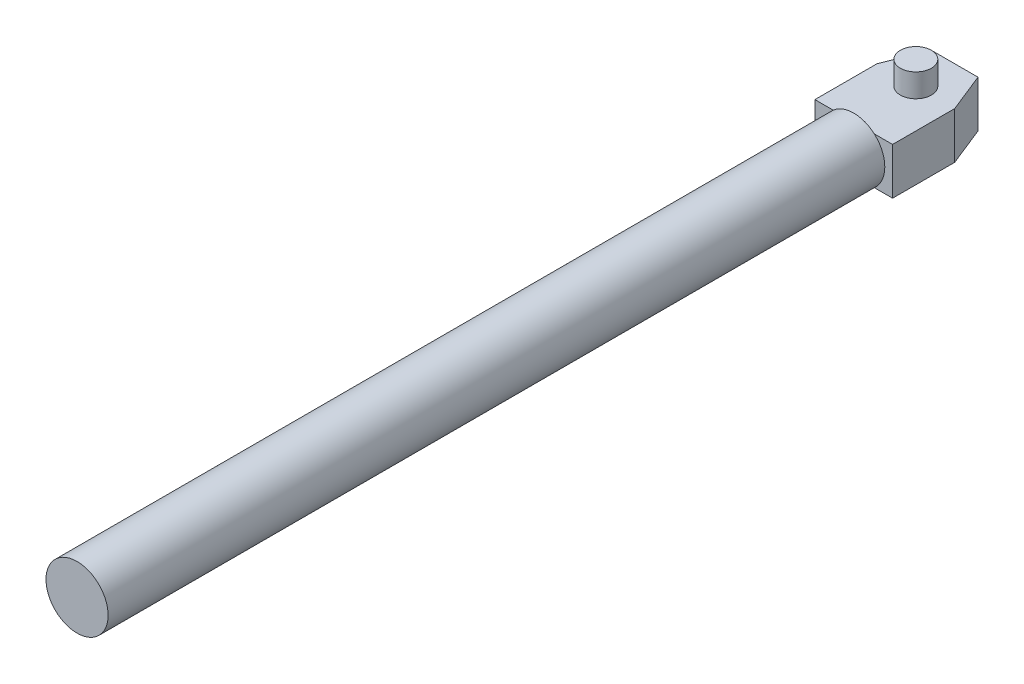
ISO-10303-21;
HEADER;
FILE_DESCRIPTION(('STEP AP214'),'2;1');
FILE_NAME('part.step','',(''),(''),'','','');
FILE_SCHEMA(('AUTOMOTIVE_DESIGN { 1 0 10303 214 1 1 1 1 }'));
ENDSEC;
DATA;
#1=APPLICATION_CONTEXT('core data for automotive mechanical design processes');
#2=APPLICATION_PROTOCOL_DEFINITION('international standard','automotive_design',2000,#1);
#3=PRODUCT_CONTEXT('',#1,'mechanical');
#4=PRODUCT('Part','Part','',(#3));
#5=PRODUCT_RELATED_PRODUCT_CATEGORY('part','',(#4));
#6=PRODUCT_DEFINITION_FORMATION('','',#4);
#7=PRODUCT_DEFINITION_CONTEXT('part definition',#1,'design');
#8=PRODUCT_DEFINITION('design','',#6,#7);
#9=PRODUCT_DEFINITION_SHAPE('','',#8);
#10=(LENGTH_UNIT() NAMED_UNIT(*) SI_UNIT(.MILLI.,.METRE.));
#11=(NAMED_UNIT(*) PLANE_ANGLE_UNIT() SI_UNIT($,.RADIAN.));
#12=(NAMED_UNIT(*) SI_UNIT($,.STERADIAN.) SOLID_ANGLE_UNIT());
#13=UNCERTAINTY_MEASURE_WITH_UNIT(LENGTH_MEASURE(1.E-05),#10,'distance_accuracy_value','');
#14=(GEOMETRIC_REPRESENTATION_CONTEXT(3) GLOBAL_UNCERTAINTY_ASSIGNED_CONTEXT((#13)) GLOBAL_UNIT_ASSIGNED_CONTEXT((#10,
#11,#12)) REPRESENTATION_CONTEXT('',''));
#15=CARTESIAN_POINT('',(0.,0.,0.));
#16=DIRECTION('',(0.,0.,1.));
#17=DIRECTION('',(1.,0.,0.));
#18=AXIS2_PLACEMENT_3D('',#15,#16,#17);
#19=CARTESIAN_POINT('',(0.,0.,0.));
#20=DIRECTION('',(0.,0.,1.));
#21=DIRECTION('',(1.,0.,0.));
#22=AXIS2_PLACEMENT_3D('',#19,#20,#21);
#23=PLANE('',#22);
#24=DIRECTION('',(1.,0.,0.));
#25=VECTOR('',#24,1.);
#26=CARTESIAN_POINT('',(-25.,15.,0.));
#27=LINE('',#26,#25);
#28=CARTESIAN_POINT('',(-13.2287565553229,15.,0.));
#29=VERTEX_POINT('',#28);
#30=CARTESIAN_POINT('',(13.2287565553229,15.,0.));
#31=VERTEX_POINT('',#30);
#32=EDGE_CURVE('E114',#29,#31,#27,.T.);
#33=ORIENTED_EDGE('',*,*,#32,.F.);
#34=CARTESIAN_POINT('',(0.,0.,0.));
#35=DIRECTION('',(0.,0.,1.));
#36=DIRECTION('',(1.,0.,0.));
#37=AXIS2_PLACEMENT_3D('',#34,#35,#36);
#38=CIRCLE('',#37,20.);
#39=EDGE_CURVE('E132',#31,#29,#38,.T.);
#40=ORIENTED_EDGE('',*,*,#39,.F.);
#41=EDGE_LOOP('',(#33,#40));
#42=FACE_BOUND('',#41,.T.);
#43=ADVANCED_FACE('F36',(#42),#23,.F.);
#44=CARTESIAN_POINT('',(0.,0.,500.));
#45=DIRECTION('',(0.,0.,-1.));
#46=DIRECTION('',(-1.,0.,0.));
#47=AXIS2_PLACEMENT_3D('',#44,#45,#46);
#48=CYLINDRICAL_SURFACE('',#47,20.);
#49=CARTESIAN_POINT('',(0.,0.,500.));
#50=DIRECTION('',(0.,0.,1.));
#51=DIRECTION('',(1.,0.,0.));
#52=AXIS2_PLACEMENT_3D('',#49,#50,#51);
#53=CIRCLE('',#52,20.);
#54=CARTESIAN_POINT('',(20.,0.,500.));
#55=VERTEX_POINT('',#54);
#56=EDGE_CURVE('E138',#55,#55,#53,.T.);
#57=ORIENTED_EDGE('',*,*,#56,.F.);
#58=EDGE_LOOP('',(#57));
#59=FACE_BOUND('',#58,.T.);
#60=ORIENTED_EDGE('',*,*,#39,.T.);
#61=CARTESIAN_POINT('',(-13.2287565553229,-15.,0.));
#62=VERTEX_POINT('',#61);
#63=EDGE_CURVE('E108',#29,#62,#38,.T.);
#64=ORIENTED_EDGE('',*,*,#63,.T.);
#65=CARTESIAN_POINT('',(13.2287565553229,-15.,0.));
#66=VERTEX_POINT('',#65);
#67=EDGE_CURVE('E54',#62,#66,#38,.T.);
#68=ORIENTED_EDGE('',*,*,#67,.T.);
#69=EDGE_CURVE('E128',#66,#31,#38,.T.);
#70=ORIENTED_EDGE('',*,*,#69,.T.);
#71=EDGE_LOOP('',(#60,#64,#68,#70));
#72=FACE_BOUND('',#71,.T.);
#73=ADVANCED_FACE('F38',(#59,#72),#48,.T.);
#74=CARTESIAN_POINT('',(0.,0.,500.));
#75=DIRECTION('',(0.,0.,1.));
#76=DIRECTION('',(1.,0.,0.));
#77=AXIS2_PLACEMENT_3D('',#74,#75,#76);
#78=PLANE('',#77);
#79=ORIENTED_EDGE('',*,*,#56,.T.);
#80=EDGE_LOOP('',(#79));
#81=FACE_BOUND('',#80,.T.);
#82=ADVANCED_FACE('F208',(#81),#78,.T.);
#83=ORIENTED_EDGE('',*,*,#67,.F.);
#84=DIRECTION('',(1.,0.,0.));
#85=VECTOR('',#84,1.);
#86=CARTESIAN_POINT('',(-25.,-15.,0.));
#87=LINE('',#86,#85);
#88=EDGE_CURVE('E45',#62,#66,#87,.T.);
#89=ORIENTED_EDGE('',*,*,#88,.T.);
#90=EDGE_LOOP('',(#83,#89));
#91=FACE_BOUND('',#90,.T.);
#92=ADVANCED_FACE('F204',(#91),#23,.F.);
#93=CARTESIAN_POINT('',(-25.,15.,0.));
#94=DIRECTION('',(0.,0.,-1.));
#95=DIRECTION('',(-1.,0.,0.));
#96=AXIS2_PLACEMENT_3D('',#93,#94,#95);
#97=PLANE('',#96);
#98=ORIENTED_EDGE('',*,*,#63,.F.);
#99=CARTESIAN_POINT('',(-25.,15.,0.));
#100=VERTEX_POINT('',#99);
#101=EDGE_CURVE('E101',#100,#29,#27,.T.);
#102=ORIENTED_EDGE('',*,*,#101,.F.);
#103=DIRECTION('',(0.,-1.,0.));
#104=VECTOR('',#103,1.);
#105=CARTESIAN_POINT('',(-25.,15.,0.));
#106=LINE('',#105,#104);
#107=CARTESIAN_POINT('',(-25.,-15.,0.));
#108=VERTEX_POINT('',#107);
#109=EDGE_CURVE('E106',#100,#108,#106,.T.);
#110=ORIENTED_EDGE('',*,*,#109,.T.);
#111=EDGE_CURVE('E154',#108,#62,#87,.T.);
#112=ORIENTED_EDGE('',*,*,#111,.T.);
#113=EDGE_LOOP('',(#98,#102,#110,#112));
#114=FACE_BOUND('',#113,.T.);
#115=ADVANCED_FACE('F103',(#114),#97,.F.);
#116=CARTESIAN_POINT('',(-25.,15.,0.));
#117=DIRECTION('',(1.,0.,0.));
#118=DIRECTION('',(0.,0.,-1.));
#119=AXIS2_PLACEMENT_3D('',#116,#117,#118);
#120=PLANE('',#119);
#121=DIRECTION('',(0.,0.,1.));
#122=VECTOR('',#121,1.);
#123=CARTESIAN_POINT('',(-25.,-15.,0.));
#124=LINE('',#123,#122);
#125=CARTESIAN_POINT('',(-25.,-15.,-40.));
#126=VERTEX_POINT('',#125);
#127=EDGE_CURVE('E127',#126,#108,#124,.T.);
#128=ORIENTED_EDGE('',*,*,#127,.T.);
#129=ORIENTED_EDGE('',*,*,#109,.F.);
#130=DIRECTION('',(0.,0.,1.));
#131=VECTOR('',#130,1.);
#132=CARTESIAN_POINT('',(-25.,15.,0.));
#133=LINE('',#132,#131);
#134=CARTESIAN_POINT('',(-25.,15.,-40.));
#135=VERTEX_POINT('',#134);
#136=EDGE_CURVE('E116',#135,#100,#133,.T.);
#137=ORIENTED_EDGE('',*,*,#136,.F.);
#138=DIRECTION('',(0.,-1.,0.));
#139=VECTOR('',#138,1.);
#140=CARTESIAN_POINT('',(-25.,15.,-40.));
#141=LINE('',#140,#139);
#142=EDGE_CURVE('E170',#135,#126,#141,.T.);
#143=ORIENTED_EDGE('',*,*,#142,.T.);
#144=EDGE_LOOP('',(#128,#129,#137,#143));
#145=FACE_BOUND('',#144,.T.);
#146=ADVANCED_FACE('F125',(#145),#120,.F.);
#147=ORIENTED_EDGE('',*,*,#69,.F.);
#148=CARTESIAN_POINT('',(25.,-15.,0.));
#149=VERTEX_POINT('',#148);
#150=EDGE_CURVE('E148',#66,#149,#87,.T.);
#151=ORIENTED_EDGE('',*,*,#150,.T.);
#152=DIRECTION('',(0.,-1.,0.));
#153=VECTOR('',#152,1.);
#154=CARTESIAN_POINT('',(25.,15.,0.));
#155=LINE('',#154,#153);
#156=CARTESIAN_POINT('',(25.,15.,0.));
#157=VERTEX_POINT('',#156);
#158=EDGE_CURVE('E129',#157,#149,#155,.T.);
#159=ORIENTED_EDGE('',*,*,#158,.F.);
#160=EDGE_CURVE('E112',#31,#157,#27,.T.);
#161=ORIENTED_EDGE('',*,*,#160,.F.);
#162=EDGE_LOOP('',(#147,#151,#159,#161));
#163=FACE_BOUND('',#162,.T.);
#164=ADVANCED_FACE('F146',(#163),#97,.F.);
#165=CARTESIAN_POINT('',(25.,15.,0.));
#166=DIRECTION('',(-1.,0.,0.));
#167=DIRECTION('',(0.,0.,1.));
#168=AXIS2_PLACEMENT_3D('',#165,#166,#167);
#169=PLANE('',#168);
#170=DIRECTION('',(0.,0.,-1.));
#171=VECTOR('',#170,1.);
#172=CARTESIAN_POINT('',(25.,-15.,0.));
#173=LINE('',#172,#171);
#174=CARTESIAN_POINT('',(25.,-15.,-40.));
#175=VERTEX_POINT('',#174);
#176=EDGE_CURVE('E153',#149,#175,#173,.T.);
#177=ORIENTED_EDGE('',*,*,#176,.T.);
#178=DIRECTION('',(0.,-1.,0.));
#179=VECTOR('',#178,1.);
#180=CARTESIAN_POINT('',(25.,15.,-40.));
#181=LINE('',#180,#179);
#182=CARTESIAN_POINT('',(25.,15.,-40.));
#183=VERTEX_POINT('',#182);
#184=EDGE_CURVE('E134',#183,#175,#181,.T.);
#185=ORIENTED_EDGE('',*,*,#184,.F.);
#186=DIRECTION('',(0.,0.,-1.));
#187=VECTOR('',#186,1.);
#188=CARTESIAN_POINT('',(25.,15.,0.));
#189=LINE('',#188,#187);
#190=EDGE_CURVE('E111',#157,#183,#189,.T.);
#191=ORIENTED_EDGE('',*,*,#190,.F.);
#192=ORIENTED_EDGE('',*,*,#158,.T.);
#193=EDGE_LOOP('',(#177,#185,#191,#192));
#194=FACE_BOUND('',#193,.T.);
#195=ADVANCED_FACE('F162',(#194),#169,.F.);
#196=CARTESIAN_POINT('',(15.,15.,-65.));
#197=DIRECTION('',(-0.928476690885259,0.,0.371390676354104));
#198=DIRECTION('',(0.371390676354104,0.,0.928476690885259));
#199=AXIS2_PLACEMENT_3D('',#196,#197,#198);
#200=PLANE('',#199);
#201=DIRECTION('',(-0.371390676354104,0.,-0.928476690885259));
#202=VECTOR('',#201,1.);
#203=CARTESIAN_POINT('',(15.,-15.,-65.));
#204=LINE('',#203,#202);
#205=CARTESIAN_POINT('',(15.,-15.,-65.));
#206=VERTEX_POINT('',#205);
#207=EDGE_CURVE('E183',#175,#206,#204,.T.);
#208=ORIENTED_EDGE('',*,*,#207,.T.);
#209=DIRECTION('',(0.,-1.,0.));
#210=VECTOR('',#209,1.);
#211=CARTESIAN_POINT('',(15.,15.,-65.));
#212=LINE('',#211,#210);
#213=CARTESIAN_POINT('',(15.,15.,-65.));
#214=VERTEX_POINT('',#213);
#215=EDGE_CURVE('E174',#214,#206,#212,.T.);
#216=ORIENTED_EDGE('',*,*,#215,.F.);
#217=DIRECTION('',(-0.371390676354104,0.,-0.928476690885259));
#218=VECTOR('',#217,1.);
#219=CARTESIAN_POINT('',(15.,15.,-65.));
#220=LINE('',#219,#218);
#221=EDGE_CURVE('E165',#183,#214,#220,.T.);
#222=ORIENTED_EDGE('',*,*,#221,.F.);
#223=ORIENTED_EDGE('',*,*,#184,.T.);
#224=EDGE_LOOP('',(#208,#216,#222,#223));
#225=FACE_BOUND('',#224,.T.);
#226=ADVANCED_FACE('F181',(#225),#200,.F.);
#227=CARTESIAN_POINT('',(-15.,15.,-65.));
#228=DIRECTION('',(0.,0.,1.));
#229=DIRECTION('',(1.,0.,0.));
#230=AXIS2_PLACEMENT_3D('',#227,#228,#229);
#231=PLANE('',#230);
#232=DIRECTION('',(-1.,0.,0.));
#233=VECTOR('',#232,1.);
#234=CARTESIAN_POINT('',(-15.,-15.,-65.));
#235=LINE('',#234,#233);
#236=CARTESIAN_POINT('',(-15.,-15.,-65.));
#237=VERTEX_POINT('',#236);
#238=EDGE_CURVE('E186',#206,#237,#235,.T.);
#239=ORIENTED_EDGE('',*,*,#238,.T.);
#240=DIRECTION('',(0.,-1.,0.));
#241=VECTOR('',#240,1.);
#242=CARTESIAN_POINT('',(-15.,15.,-65.));
#243=LINE('',#242,#241);
#244=CARTESIAN_POINT('',(-15.,15.,-65.));
#245=VERTEX_POINT('',#244);
#246=EDGE_CURVE('E171',#245,#237,#243,.T.);
#247=ORIENTED_EDGE('',*,*,#246,.F.);
#248=DIRECTION('',(-1.,0.,0.));
#249=VECTOR('',#248,1.);
#250=CARTESIAN_POINT('',(-15.,15.,-65.));
#251=LINE('',#250,#249);
#252=EDGE_CURVE('E166',#214,#245,#251,.T.);
#253=ORIENTED_EDGE('',*,*,#252,.F.);
#254=ORIENTED_EDGE('',*,*,#215,.T.);
#255=EDGE_LOOP('',(#239,#247,#253,#254));
#256=FACE_BOUND('',#255,.T.);
#257=ADVANCED_FACE('F193',(#256),#231,.F.);
#258=CARTESIAN_POINT('',(-25.,15.,-40.));
#259=DIRECTION('',(0.928476690885259,0.,0.371390676354104));
#260=DIRECTION('',(0.371390676354104,0.,-0.928476690885259));
#261=AXIS2_PLACEMENT_3D('',#258,#259,#260);
#262=PLANE('',#261);
#263=DIRECTION('',(-0.371390676354104,0.,0.928476690885259));
#264=VECTOR('',#263,1.);
#265=CARTESIAN_POINT('',(-25.,-15.,-40.));
#266=LINE('',#265,#264);
#267=EDGE_CURVE('E123',#237,#126,#266,.T.);
#268=ORIENTED_EDGE('',*,*,#267,.T.);
#269=ORIENTED_EDGE('',*,*,#142,.F.);
#270=DIRECTION('',(-0.371390676354104,0.,0.928476690885259));
#271=VECTOR('',#270,1.);
#272=CARTESIAN_POINT('',(-25.,15.,-40.));
#273=LINE('',#272,#271);
#274=EDGE_CURVE('E119',#245,#135,#273,.T.);
#275=ORIENTED_EDGE('',*,*,#274,.F.);
#276=ORIENTED_EDGE('',*,*,#246,.T.);
#277=EDGE_LOOP('',(#268,#269,#275,#276));
#278=FACE_BOUND('',#277,.T.);
#279=ADVANCED_FACE('F191',(#278),#262,.F.);
#280=CARTESIAN_POINT('',(0.,15.,0.));
#281=DIRECTION('',(0.,-1.,0.));
#282=DIRECTION('',(0.,0.,-1.));
#283=AXIS2_PLACEMENT_3D('',#280,#281,#282);
#284=PLANE('',#283);
#285=CARTESIAN_POINT('',(0.,15.,-40.));
#286=DIRECTION('',(0.,-1.,0.));
#287=DIRECTION('',(0.,0.,-1.));
#288=AXIS2_PLACEMENT_3D('',#285,#286,#287);
#289=CIRCLE('',#288,10.);
#290=CARTESIAN_POINT('',(0.,15.,-50.));
#291=VERTEX_POINT('',#290);
#292=EDGE_CURVE('E11',#291,#291,#289,.F.);
#293=ORIENTED_EDGE('',*,*,#292,.F.);
#294=EDGE_LOOP('',(#293));
#295=FACE_BOUND('',#294,.T.);
#296=ORIENTED_EDGE('',*,*,#136,.T.);
#297=ORIENTED_EDGE('',*,*,#101,.T.);
#298=ORIENTED_EDGE('',*,*,#32,.T.);
#299=ORIENTED_EDGE('',*,*,#160,.T.);
#300=ORIENTED_EDGE('',*,*,#190,.T.);
#301=ORIENTED_EDGE('',*,*,#221,.T.);
#302=ORIENTED_EDGE('',*,*,#252,.T.);
#303=ORIENTED_EDGE('',*,*,#274,.T.);
#304=EDGE_LOOP('',(#296,#297,#298,#299,#300,#301,#302,#303));
#305=FACE_BOUND('',#304,.T.);
#306=ADVANCED_FACE('F117',(#295,#305),#284,.F.);
#307=CARTESIAN_POINT('',(0.,-15.,0.));
#308=DIRECTION('',(0.,-1.,0.));
#309=DIRECTION('',(0.,0.,-1.));
#310=AXIS2_PLACEMENT_3D('',#307,#308,#309);
#311=PLANE('',#310);
#312=CARTESIAN_POINT('',(0.,-15.,-40.));
#313=DIRECTION('',(0.,-1.,0.));
#314=DIRECTION('',(0.,0.,-1.));
#315=AXIS2_PLACEMENT_3D('',#312,#313,#314);
#316=CIRCLE('',#315,10.);
#317=CARTESIAN_POINT('',(0.,-15.,-50.));
#318=VERTEX_POINT('',#317);
#319=EDGE_CURVE('E40',#318,#318,#316,.F.);
#320=ORIENTED_EDGE('',*,*,#319,.T.);
#321=EDGE_LOOP('',(#320));
#322=FACE_BOUND('',#321,.T.);
#323=ORIENTED_EDGE('',*,*,#127,.F.);
#324=ORIENTED_EDGE('',*,*,#267,.F.);
#325=ORIENTED_EDGE('',*,*,#238,.F.);
#326=ORIENTED_EDGE('',*,*,#207,.F.);
#327=ORIENTED_EDGE('',*,*,#176,.F.);
#328=ORIENTED_EDGE('',*,*,#150,.F.);
#329=ORIENTED_EDGE('',*,*,#88,.F.);
#330=ORIENTED_EDGE('',*,*,#111,.F.);
#331=EDGE_LOOP('',(#323,#324,#325,#326,#327,#328,#329,#330));
#332=FACE_BOUND('',#331,.T.);
#333=ADVANCED_FACE('F151',(#322,#332),#311,.T.);
#334=CARTESIAN_POINT('',(0.,-30.,-40.));
#335=DIRECTION('',(0.,1.,0.));
#336=DIRECTION('',(0.,0.,1.));
#337=AXIS2_PLACEMENT_3D('',#334,#335,#336);
#338=PLANE('',#337);
#339=CARTESIAN_POINT('',(0.,-30.,-40.));
#340=DIRECTION('',(0.,1.,0.));
#341=DIRECTION('',(0.,0.,1.));
#342=AXIS2_PLACEMENT_3D('',#339,#340,#341);
#343=CIRCLE('',#342,10.);
#344=CARTESIAN_POINT('',(0.,-30.,-30.));
#345=VERTEX_POINT('',#344);
#346=EDGE_CURVE('E337',#345,#345,#343,.T.);
#347=ORIENTED_EDGE('',*,*,#346,.F.);
#348=EDGE_LOOP('',(#347));
#349=FACE_BOUND('',#348,.T.);
#350=ADVANCED_FACE('F263',(#349),#338,.F.);
#351=CARTESIAN_POINT('',(0.,30.,-40.));
#352=DIRECTION('',(0.,-1.,0.));
#353=DIRECTION('',(0.,0.,-1.));
#354=AXIS2_PLACEMENT_3D('',#351,#352,#353);
#355=CYLINDRICAL_SURFACE('',#354,10.);
#356=ORIENTED_EDGE('',*,*,#319,.F.);
#357=EDGE_LOOP('',(#356));
#358=FACE_BOUND('',#357,.T.);
#359=ORIENTED_EDGE('',*,*,#346,.T.);
#360=EDGE_LOOP('',(#359));
#361=FACE_BOUND('',#360,.T.);
#362=ADVANCED_FACE('F302',(#358,#361),#355,.T.);
#363=CARTESIAN_POINT('',(0.,30.,-40.));
#364=DIRECTION('',(0.,1.,0.));
#365=DIRECTION('',(0.,0.,1.));
#366=AXIS2_PLACEMENT_3D('',#363,#364,#365);
#367=CIRCLE('',#366,10.);
#368=CARTESIAN_POINT('',(0.,30.,-30.));
#369=VERTEX_POINT('',#368);
#370=EDGE_CURVE('E336',#369,#369,#367,.T.);
#371=ORIENTED_EDGE('',*,*,#370,.F.);
#372=EDGE_LOOP('',(#371));
#373=FACE_BOUND('',#372,.T.);
#374=ORIENTED_EDGE('',*,*,#292,.T.);
#375=EDGE_LOOP('',(#374));
#376=FACE_BOUND('',#375,.T.);
#377=ADVANCED_FACE('F311',(#373,#376),#355,.T.);
#378=CARTESIAN_POINT('',(0.,30.,-40.));
#379=DIRECTION('',(0.,1.,0.));
#380=DIRECTION('',(0.,0.,1.));
#381=AXIS2_PLACEMENT_3D('',#378,#379,#380);
#382=PLANE('',#381);
#383=ORIENTED_EDGE('',*,*,#370,.T.);
#384=EDGE_LOOP('',(#383));
#385=FACE_BOUND('',#384,.T.);
#386=ADVANCED_FACE('F320',(#385),#382,.T.);
#387=CLOSED_SHELL('',(#43,#73,#82,#92,#115,#146,#164,#195,#226,#257,#279,#306,#333,#350,#362,
#377,#386));
#388=MANIFOLD_SOLID_BREP('B2',#387);
#389=ADVANCED_BREP_SHAPE_REPRESENTATION('',(#18,#388),#14);
#390=SHAPE_DEFINITION_REPRESENTATION(#9,#389);
ENDSEC;
END-ISO-10303-21;
